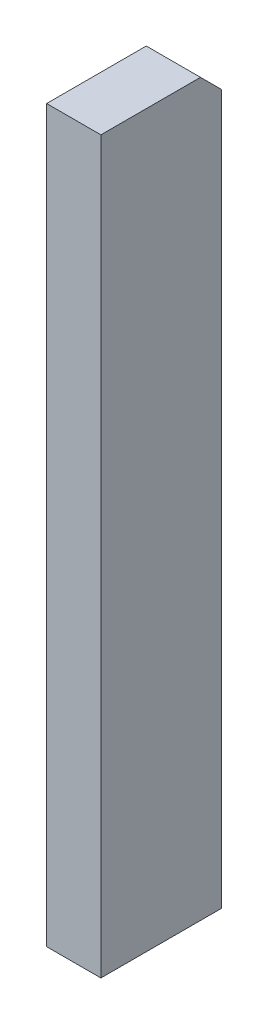
ISO-10303-21;
HEADER;
FILE_DESCRIPTION(('STEP AP214'),'2;1');
FILE_NAME('part.step','',(''),(''),'','','');
FILE_SCHEMA(('AUTOMOTIVE_DESIGN { 1 0 10303 214 1 1 1 1 }'));
ENDSEC;
DATA;
#1=APPLICATION_CONTEXT('core data for automotive mechanical design processes');
#2=APPLICATION_PROTOCOL_DEFINITION('international standard','automotive_design',2000,#1);
#3=PRODUCT_CONTEXT('',#1,'mechanical');
#4=PRODUCT('Part','Part','',(#3));
#5=PRODUCT_RELATED_PRODUCT_CATEGORY('part','',(#4));
#6=PRODUCT_DEFINITION_FORMATION('','',#4);
#7=PRODUCT_DEFINITION_CONTEXT('part definition',#1,'design');
#8=PRODUCT_DEFINITION('design','',#6,#7);
#9=PRODUCT_DEFINITION_SHAPE('','',#8);
#10=(LENGTH_UNIT() NAMED_UNIT(*) SI_UNIT(.MILLI.,.METRE.));
#11=(NAMED_UNIT(*) PLANE_ANGLE_UNIT() SI_UNIT($,.RADIAN.));
#12=(NAMED_UNIT(*) SI_UNIT($,.STERADIAN.) SOLID_ANGLE_UNIT());
#13=UNCERTAINTY_MEASURE_WITH_UNIT(LENGTH_MEASURE(1.E-05),#10,'distance_accuracy_value','');
#14=(GEOMETRIC_REPRESENTATION_CONTEXT(3) GLOBAL_UNCERTAINTY_ASSIGNED_CONTEXT((#13)) GLOBAL_UNIT_ASSIGNED_CONTEXT((#10,
#11,#12)) REPRESENTATION_CONTEXT('',''));
#15=CARTESIAN_POINT('',(0.,0.,0.));
#16=DIRECTION('',(0.,0.,1.));
#17=DIRECTION('',(1.,0.,0.));
#18=AXIS2_PLACEMENT_3D('',#15,#16,#17);
#19=CARTESIAN_POINT('',(0.,0.,5.775));
#20=DIRECTION('',(1.,0.,0.));
#21=DIRECTION('',(0.,0.,-1.));
#22=AXIS2_PLACEMENT_3D('',#19,#20,#21);
#23=PLANE('',#22);
#24=DIRECTION('',(0.,0.,-1.));
#25=VECTOR('',#24,1.);
#26=CARTESIAN_POINT('',(0.,35.,5.775));
#27=LINE('',#26,#25);
#28=CARTESIAN_POINT('',(0.,35.,5.775));
#29=VERTEX_POINT('',#28);
#30=CARTESIAN_POINT('',(0.,35.,1.));
#31=VERTEX_POINT('',#30);
#32=EDGE_CURVE('E109',#29,#31,#27,.T.);
#33=ORIENTED_EDGE('',*,*,#32,.T.);
#34=DIRECTION('',(0.,-0.707106781186548,-0.707106781186548));
#35=VECTOR('',#34,1.);
#36=CARTESIAN_POINT('',(0.,35.,1.));
#37=LINE('',#36,#35);
#38=CARTESIAN_POINT('',(0.,34.,0.));
#39=VERTEX_POINT('',#38);
#40=EDGE_CURVE('E54',#31,#39,#37,.T.);
#41=ORIENTED_EDGE('',*,*,#40,.T.);
#42=DIRECTION('',(0.,-1.,0.));
#43=VECTOR('',#42,1.);
#44=CARTESIAN_POINT('',(0.,0.,0.));
#45=LINE('',#44,#43);
#46=CARTESIAN_POINT('',(0.,0.,0.));
#47=VERTEX_POINT('',#46);
#48=EDGE_CURVE('E97',#39,#47,#45,.T.);
#49=ORIENTED_EDGE('',*,*,#48,.T.);
#50=DIRECTION('',(0.,0.,-1.));
#51=VECTOR('',#50,1.);
#52=CARTESIAN_POINT('',(0.,0.,5.775));
#53=LINE('',#52,#51);
#54=CARTESIAN_POINT('',(0.,0.,5.775));
#55=VERTEX_POINT('',#54);
#56=EDGE_CURVE('E82',#55,#47,#53,.T.);
#57=ORIENTED_EDGE('',*,*,#56,.F.);
#58=DIRECTION('',(0.,-1.,0.));
#59=VECTOR('',#58,1.);
#60=CARTESIAN_POINT('',(0.,0.,5.775));
#61=LINE('',#60,#59);
#62=EDGE_CURVE('E88',#29,#55,#61,.T.);
#63=ORIENTED_EDGE('',*,*,#62,.F.);
#64=EDGE_LOOP('',(#33,#41,#49,#57,#63));
#65=FACE_BOUND('',#64,.T.);
#66=ADVANCED_FACE('F32',(#65),#23,.F.);
#67=CARTESIAN_POINT('',(0.,0.,5.775));
#68=DIRECTION('',(0.,1.,0.));
#69=DIRECTION('',(0.,0.,1.));
#70=AXIS2_PLACEMENT_3D('',#67,#68,#69);
#71=PLANE('',#70);
#72=DIRECTION('',(1.,0.,0.));
#73=VECTOR('',#72,1.);
#74=CARTESIAN_POINT('',(0.,0.,0.));
#75=LINE('',#74,#73);
#76=CARTESIAN_POINT('',(2.6,0.,0.));
#77=VERTEX_POINT('',#76);
#78=EDGE_CURVE('E112',#47,#77,#75,.T.);
#79=ORIENTED_EDGE('',*,*,#78,.T.);
#80=DIRECTION('',(0.,0.,-1.));
#81=VECTOR('',#80,1.);
#82=CARTESIAN_POINT('',(2.6,0.,5.775));
#83=LINE('',#82,#81);
#84=CARTESIAN_POINT('',(2.6,0.,5.775));
#85=VERTEX_POINT('',#84);
#86=EDGE_CURVE('E84',#85,#77,#83,.T.);
#87=ORIENTED_EDGE('',*,*,#86,.F.);
#88=DIRECTION('',(1.,0.,0.));
#89=VECTOR('',#88,1.);
#90=CARTESIAN_POINT('',(0.,0.,5.775));
#91=LINE('',#90,#89);
#92=EDGE_CURVE('E78',#55,#85,#91,.T.);
#93=ORIENTED_EDGE('',*,*,#92,.F.);
#94=ORIENTED_EDGE('',*,*,#56,.T.);
#95=EDGE_LOOP('',(#79,#87,#93,#94));
#96=FACE_BOUND('',#95,.T.);
#97=ADVANCED_FACE('F80',(#96),#71,.F.);
#98=CARTESIAN_POINT('',(2.6,0.,5.775));
#99=DIRECTION('',(-1.,0.,0.));
#100=DIRECTION('',(0.,0.,1.));
#101=AXIS2_PLACEMENT_3D('',#98,#99,#100);
#102=PLANE('',#101);
#103=DIRECTION('',(0.,1.,0.));
#104=VECTOR('',#103,1.);
#105=CARTESIAN_POINT('',(2.6,0.,0.));
#106=LINE('',#105,#104);
#107=CARTESIAN_POINT('',(2.6,34.,0.));
#108=VERTEX_POINT('',#107);
#109=EDGE_CURVE('E95',#77,#108,#106,.T.);
#110=ORIENTED_EDGE('',*,*,#109,.T.);
#111=DIRECTION('',(0.,0.707106781186548,0.707106781186548));
#112=VECTOR('',#111,1.);
#113=CARTESIAN_POINT('',(2.6,35.,1.));
#114=LINE('',#113,#112);
#115=CARTESIAN_POINT('',(2.6,35.,1.));
#116=VERTEX_POINT('',#115);
#117=EDGE_CURVE('E11',#108,#116,#114,.T.);
#118=ORIENTED_EDGE('',*,*,#117,.T.);
#119=DIRECTION('',(0.,0.,-1.));
#120=VECTOR('',#119,1.);
#121=CARTESIAN_POINT('',(2.6,35.,5.775));
#122=LINE('',#121,#120);
#123=CARTESIAN_POINT('',(2.6,35.,5.775));
#124=VERTEX_POINT('',#123);
#125=EDGE_CURVE('E103',#124,#116,#122,.T.);
#126=ORIENTED_EDGE('',*,*,#125,.F.);
#127=DIRECTION('',(0.,1.,0.));
#128=VECTOR('',#127,1.);
#129=CARTESIAN_POINT('',(2.6,0.,5.775));
#130=LINE('',#129,#128);
#131=EDGE_CURVE('E87',#85,#124,#130,.T.);
#132=ORIENTED_EDGE('',*,*,#131,.F.);
#133=ORIENTED_EDGE('',*,*,#86,.T.);
#134=EDGE_LOOP('',(#110,#118,#126,#132,#133));
#135=FACE_BOUND('',#134,.T.);
#136=ADVANCED_FACE('F118',(#135),#102,.F.);
#137=CARTESIAN_POINT('',(0.,35.,5.775));
#138=DIRECTION('',(0.,-1.,0.));
#139=DIRECTION('',(0.,0.,-1.));
#140=AXIS2_PLACEMENT_3D('',#137,#138,#139);
#141=PLANE('',#140);
#142=ORIENTED_EDGE('',*,*,#125,.T.);
#143=DIRECTION('',(-1.,0.,0.));
#144=VECTOR('',#143,1.);
#145=CARTESIAN_POINT('',(0.,35.,1.));
#146=LINE('',#145,#144);
#147=EDGE_CURVE('E99',#116,#31,#146,.T.);
#148=ORIENTED_EDGE('',*,*,#147,.T.);
#149=ORIENTED_EDGE('',*,*,#32,.F.);
#150=DIRECTION('',(-1.,0.,0.));
#151=VECTOR('',#150,1.);
#152=CARTESIAN_POINT('',(0.,35.,5.775));
#153=LINE('',#152,#151);
#154=EDGE_CURVE('E93',#124,#29,#153,.T.);
#155=ORIENTED_EDGE('',*,*,#154,.F.);
#156=EDGE_LOOP('',(#142,#148,#149,#155));
#157=FACE_BOUND('',#156,.T.);
#158=ADVANCED_FACE('F122',(#157),#141,.F.);
#159=CARTESIAN_POINT('',(0.,35.,5.775));
#160=DIRECTION('',(0.,0.,-1.));
#161=DIRECTION('',(-1.,0.,0.));
#162=AXIS2_PLACEMENT_3D('',#159,#160,#161);
#163=PLANE('',#162);
#164=ORIENTED_EDGE('',*,*,#62,.T.);
#165=ORIENTED_EDGE('',*,*,#92,.T.);
#166=ORIENTED_EDGE('',*,*,#131,.T.);
#167=ORIENTED_EDGE('',*,*,#154,.T.);
#168=EDGE_LOOP('',(#164,#165,#166,#167));
#169=FACE_BOUND('',#168,.T.);
#170=ADVANCED_FACE('F91',(#169),#163,.F.);
#171=CARTESIAN_POINT('',(0.,35.,0.));
#172=DIRECTION('',(0.,0.,-1.));
#173=DIRECTION('',(-1.,0.,0.));
#174=AXIS2_PLACEMENT_3D('',#171,#172,#173);
#175=PLANE('',#174);
#176=ORIENTED_EDGE('',*,*,#48,.F.);
#177=DIRECTION('',(1.,0.,0.));
#178=VECTOR('',#177,1.);
#179=CARTESIAN_POINT('',(2.6,34.,0.));
#180=LINE('',#179,#178);
#181=EDGE_CURVE('E40',#39,#108,#180,.T.);
#182=ORIENTED_EDGE('',*,*,#181,.T.);
#183=ORIENTED_EDGE('',*,*,#109,.F.);
#184=ORIENTED_EDGE('',*,*,#78,.F.);
#185=EDGE_LOOP('',(#176,#182,#183,#184));
#186=FACE_BOUND('',#185,.T.);
#187=ADVANCED_FACE('F125',(#186),#175,.T.);
#188=CARTESIAN_POINT('',(0.,35.,1.));
#189=DIRECTION('',(0.,0.707106781186547,-0.707106781186547));
#190=DIRECTION('',(0.,0.707106781186548,0.707106781186548));
#191=AXIS2_PLACEMENT_3D('',#188,#189,#190);
#192=PLANE('',#191);
#193=ORIENTED_EDGE('',*,*,#117,.F.);
#194=ORIENTED_EDGE('',*,*,#181,.F.);
#195=ORIENTED_EDGE('',*,*,#40,.F.);
#196=ORIENTED_EDGE('',*,*,#147,.F.);
#197=EDGE_LOOP('',(#193,#194,#195,#196));
#198=FACE_BOUND('',#197,.T.);
#199=ADVANCED_FACE('F34',(#198),#192,.T.);
#200=CLOSED_SHELL('',(#66,#97,#136,#158,#170,#187,#199));
#201=MANIFOLD_SOLID_BREP('B2',#200);
#202=ADVANCED_BREP_SHAPE_REPRESENTATION('',(#18,#201),#14);
#203=SHAPE_DEFINITION_REPRESENTATION(#9,#202);
ENDSEC;
END-ISO-10303-21;
